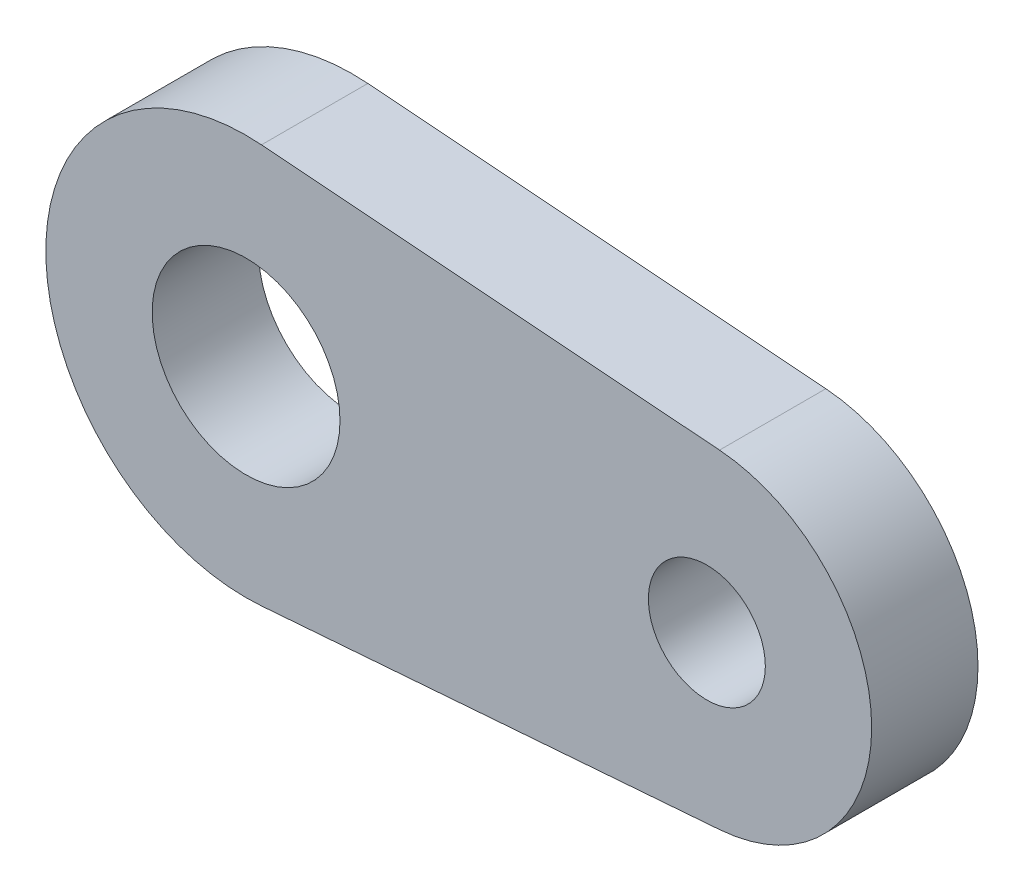
ISO-10303-21;
HEADER;
FILE_DESCRIPTION(('STEP AP214'),'2;1');
FILE_NAME('part.step','',(''),(''),'','','');
FILE_SCHEMA(('AUTOMOTIVE_DESIGN { 1 0 10303 214 1 1 1 1 }'));
ENDSEC;
DATA;
#1=APPLICATION_CONTEXT('core data for automotive mechanical design processes');
#2=APPLICATION_PROTOCOL_DEFINITION('international standard','automotive_design',2000,#1);
#3=PRODUCT_CONTEXT('',#1,'mechanical');
#4=PRODUCT('Part','Part','',(#3));
#5=PRODUCT_RELATED_PRODUCT_CATEGORY('part','',(#4));
#6=PRODUCT_DEFINITION_FORMATION('','',#4);
#7=PRODUCT_DEFINITION_CONTEXT('part definition',#1,'design');
#8=PRODUCT_DEFINITION('design','',#6,#7);
#9=PRODUCT_DEFINITION_SHAPE('','',#8);
#10=(LENGTH_UNIT() NAMED_UNIT(*) SI_UNIT(.MILLI.,.METRE.));
#11=(NAMED_UNIT(*) PLANE_ANGLE_UNIT() SI_UNIT($,.RADIAN.));
#12=(NAMED_UNIT(*) SI_UNIT($,.STERADIAN.) SOLID_ANGLE_UNIT());
#13=UNCERTAINTY_MEASURE_WITH_UNIT(LENGTH_MEASURE(1.E-05),#10,'distance_accuracy_value','');
#14=(GEOMETRIC_REPRESENTATION_CONTEXT(3) GLOBAL_UNCERTAINTY_ASSIGNED_CONTEXT((#13)) GLOBAL_UNIT_ASSIGNED_CONTEXT((#10,
#11,#12)) REPRESENTATION_CONTEXT('',''));
#15=CARTESIAN_POINT('',(0.,0.,0.));
#16=DIRECTION('',(0.,0.,1.));
#17=DIRECTION('',(1.,0.,0.));
#18=AXIS2_PLACEMENT_3D('',#15,#16,#17);
#19=CARTESIAN_POINT('',(0.,0.,1.5));
#20=DIRECTION('',(0.,0.,-1.));
#21=DIRECTION('',(-1.,0.,0.));
#22=AXIS2_PLACEMENT_3D('',#19,#20,#21);
#23=PLANE('',#22);
#24=CARTESIAN_POINT('',(0.,0.,1.5));
#25=DIRECTION('',(0.,0.,1.));
#26=DIRECTION('',(-1.,0.,0.));
#27=AXIS2_PLACEMENT_3D('',#24,#25,#26);
#28=CIRCLE('',#27,5.65);
#29=CARTESIAN_POINT('',(0.434615384615384,5.63325922246222,1.5));
#30=VERTEX_POINT('',#29);
#31=CARTESIAN_POINT('',(0.434615384615384,-5.63325922246222,1.5));
#32=VERTEX_POINT('',#31);
#33=EDGE_CURVE('E92',#30,#32,#28,.T.);
#34=ORIENTED_EDGE('',*,*,#33,.T.);
#35=DIRECTION('',(0.997037030524286,0.0769230769230769,0.));
#36=VECTOR('',#35,1.);
#37=CARTESIAN_POINT('',(13.3576923076923,-4.63622219193793,1.5));
#38=LINE('',#37,#36);
#39=CARTESIAN_POINT('',(13.3576923076923,-4.63622219193793,1.5));
#40=VERTEX_POINT('',#39);
#41=EDGE_CURVE('E87',#32,#40,#38,.T.);
#42=ORIENTED_EDGE('',*,*,#41,.T.);
#43=CARTESIAN_POINT('',(13.,0.,1.5));
#44=DIRECTION('',(0.,0.,1.));
#45=DIRECTION('',(-1.,0.,0.));
#46=AXIS2_PLACEMENT_3D('',#43,#44,#45);
#47=CIRCLE('',#46,4.65);
#48=CARTESIAN_POINT('',(13.3576923076923,4.63622219193793,1.5));
#49=VERTEX_POINT('',#48);
#50=EDGE_CURVE('E90',#40,#49,#47,.T.);
#51=ORIENTED_EDGE('',*,*,#50,.T.);
#52=DIRECTION('',(-0.997037030524286,0.0769230769230769,0.));
#53=VECTOR('',#52,1.);
#54=CARTESIAN_POINT('',(0.434615384615384,5.63325922246222,1.5));
#55=LINE('',#54,#53);
#56=EDGE_CURVE('E57',#49,#30,#55,.T.);
#57=ORIENTED_EDGE('',*,*,#56,.T.);
#58=EDGE_LOOP('',(#34,#42,#51,#57));
#59=FACE_BOUND('',#58,.T.);
#60=CARTESIAN_POINT('',(0.,0.,1.5));
#61=DIRECTION('',(0.,0.,1.));
#62=DIRECTION('',(1.,0.,0.));
#63=AXIS2_PLACEMENT_3D('',#60,#61,#62);
#64=CIRCLE('',#63,2.65);
#65=CARTESIAN_POINT('',(2.65,0.,1.5));
#66=VERTEX_POINT('',#65);
#67=EDGE_CURVE('E112',#66,#66,#64,.T.);
#68=ORIENTED_EDGE('',*,*,#67,.F.);
#69=EDGE_LOOP('',(#68));
#70=FACE_BOUND('',#69,.T.);
#71=CARTESIAN_POINT('',(13.,0.,1.5));
#72=DIRECTION('',(0.,0.,1.));
#73=DIRECTION('',(1.,0.,0.));
#74=AXIS2_PLACEMENT_3D('',#71,#72,#73);
#75=CIRCLE('',#74,1.65);
#76=CARTESIAN_POINT('',(14.65,0.,1.5));
#77=VERTEX_POINT('',#76);
#78=EDGE_CURVE('E134',#77,#77,#75,.T.);
#79=ORIENTED_EDGE('',*,*,#78,.F.);
#80=EDGE_LOOP('',(#79));
#81=FACE_BOUND('',#80,.T.);
#82=ADVANCED_FACE('F39',(#59,#70,#81),#23,.F.);
#83=CARTESIAN_POINT('',(0.,0.,-1.5));
#84=DIRECTION('',(0.,0.,-1.));
#85=DIRECTION('',(-1.,0.,0.));
#86=AXIS2_PLACEMENT_3D('',#83,#84,#85);
#87=PLANE('',#86);
#88=CARTESIAN_POINT('',(0.,0.,-1.5));
#89=DIRECTION('',(0.,0.,1.));
#90=DIRECTION('',(1.,0.,0.));
#91=AXIS2_PLACEMENT_3D('',#88,#89,#90);
#92=CIRCLE('',#91,2.65);
#93=CARTESIAN_POINT('',(2.65,0.,-1.5));
#94=VERTEX_POINT('',#93);
#95=EDGE_CURVE('E130',#94,#94,#92,.T.);
#96=ORIENTED_EDGE('',*,*,#95,.T.);
#97=EDGE_LOOP('',(#96));
#98=FACE_BOUND('',#97,.T.);
#99=CARTESIAN_POINT('',(0.,0.,-1.5));
#100=DIRECTION('',(0.,0.,1.));
#101=DIRECTION('',(-1.,0.,0.));
#102=AXIS2_PLACEMENT_3D('',#99,#100,#101);
#103=CIRCLE('',#102,5.65);
#104=CARTESIAN_POINT('',(0.434615384615384,5.63325922246222,-1.5));
#105=VERTEX_POINT('',#104);
#106=CARTESIAN_POINT('',(0.434615384615384,-5.63325922246222,-1.5));
#107=VERTEX_POINT('',#106);
#108=EDGE_CURVE('E108',#105,#107,#103,.T.);
#109=ORIENTED_EDGE('',*,*,#108,.F.);
#110=DIRECTION('',(-0.997037030524286,0.0769230769230769,0.));
#111=VECTOR('',#110,1.);
#112=CARTESIAN_POINT('',(0.434615384615384,5.63325922246222,-1.5));
#113=LINE('',#112,#111);
#114=CARTESIAN_POINT('',(13.3576923076923,4.63622219193793,-1.5));
#115=VERTEX_POINT('',#114);
#116=EDGE_CURVE('E80',#115,#105,#113,.T.);
#117=ORIENTED_EDGE('',*,*,#116,.F.);
#118=CARTESIAN_POINT('',(13.,0.,-1.5));
#119=DIRECTION('',(0.,0.,1.));
#120=DIRECTION('',(-1.,0.,0.));
#121=AXIS2_PLACEMENT_3D('',#118,#119,#120);
#122=CIRCLE('',#121,4.65);
#123=CARTESIAN_POINT('',(13.3576923076923,-4.63622219193793,-1.5));
#124=VERTEX_POINT('',#123);
#125=EDGE_CURVE('E74',#124,#115,#122,.T.);
#126=ORIENTED_EDGE('',*,*,#125,.F.);
#127=DIRECTION('',(0.997037030524286,0.0769230769230769,0.));
#128=VECTOR('',#127,1.);
#129=CARTESIAN_POINT('',(13.3576923076923,-4.63622219193793,-1.5));
#130=LINE('',#129,#128);
#131=EDGE_CURVE('E97',#107,#124,#130,.T.);
#132=ORIENTED_EDGE('',*,*,#131,.F.);
#133=EDGE_LOOP('',(#109,#117,#126,#132));
#134=FACE_BOUND('',#133,.T.);
#135=CARTESIAN_POINT('',(13.,0.,-1.5));
#136=DIRECTION('',(0.,0.,1.));
#137=DIRECTION('',(1.,0.,0.));
#138=AXIS2_PLACEMENT_3D('',#135,#136,#137);
#139=CIRCLE('',#138,1.65);
#140=CARTESIAN_POINT('',(14.65,0.,-1.5));
#141=VERTEX_POINT('',#140);
#142=EDGE_CURVE('E138',#141,#141,#139,.T.);
#143=ORIENTED_EDGE('',*,*,#142,.T.);
#144=EDGE_LOOP('',(#143));
#145=FACE_BOUND('',#144,.T.);
#146=ADVANCED_FACE('F125',(#98,#134,#145),#87,.T.);
#147=CARTESIAN_POINT('',(0.,0.,1.5));
#148=DIRECTION('',(0.,0.,-1.));
#149=DIRECTION('',(-1.,0.,0.));
#150=AXIS2_PLACEMENT_3D('',#147,#148,#149);
#151=CYLINDRICAL_SURFACE('',#150,5.65);
#152=ORIENTED_EDGE('',*,*,#108,.T.);
#153=DIRECTION('',(0.,0.,-1.));
#154=VECTOR('',#153,1.);
#155=CARTESIAN_POINT('',(0.434615384615384,-5.63325922246222,1.5));
#156=LINE('',#155,#154);
#157=EDGE_CURVE('E11',#32,#107,#156,.T.);
#158=ORIENTED_EDGE('',*,*,#157,.F.);
#159=ORIENTED_EDGE('',*,*,#33,.F.);
#160=DIRECTION('',(0.,0.,-1.));
#161=VECTOR('',#160,1.);
#162=CARTESIAN_POINT('',(0.434615384615384,5.63325922246222,1.5));
#163=LINE('',#162,#161);
#164=EDGE_CURVE('E104',#30,#105,#163,.T.);
#165=ORIENTED_EDGE('',*,*,#164,.T.);
#166=EDGE_LOOP('',(#152,#158,#159,#165));
#167=FACE_BOUND('',#166,.T.);
#168=ADVANCED_FACE('F41',(#167),#151,.T.);
#169=CARTESIAN_POINT('',(13.3576923076923,-4.63622219193793,1.5));
#170=DIRECTION('',(-0.0769230769230769,0.997037030524286,0.));
#171=DIRECTION('',(-0.997037030524286,-0.0769230769230769,0.));
#172=AXIS2_PLACEMENT_3D('',#169,#170,#171);
#173=PLANE('',#172);
#174=ORIENTED_EDGE('',*,*,#131,.T.);
#175=DIRECTION('',(0.,0.,-1.));
#176=VECTOR('',#175,1.);
#177=CARTESIAN_POINT('',(13.3576923076923,-4.63622219193793,1.5));
#178=LINE('',#177,#176);
#179=EDGE_CURVE('E49',#40,#124,#178,.T.);
#180=ORIENTED_EDGE('',*,*,#179,.F.);
#181=ORIENTED_EDGE('',*,*,#41,.F.);
#182=ORIENTED_EDGE('',*,*,#157,.T.);
#183=EDGE_LOOP('',(#174,#180,#181,#182));
#184=FACE_BOUND('',#183,.T.);
#185=ADVANCED_FACE('F96',(#184),#173,.F.);
#186=CARTESIAN_POINT('',(13.,0.,1.5));
#187=DIRECTION('',(0.,0.,-1.));
#188=DIRECTION('',(-1.,0.,0.));
#189=AXIS2_PLACEMENT_3D('',#186,#187,#188);
#190=CYLINDRICAL_SURFACE('',#189,4.65);
#191=ORIENTED_EDGE('',*,*,#125,.T.);
#192=DIRECTION('',(0.,0.,-1.));
#193=VECTOR('',#192,1.);
#194=CARTESIAN_POINT('',(13.3576923076923,4.63622219193793,1.5));
#195=LINE('',#194,#193);
#196=EDGE_CURVE('E99',#49,#115,#195,.T.);
#197=ORIENTED_EDGE('',*,*,#196,.F.);
#198=ORIENTED_EDGE('',*,*,#50,.F.);
#199=ORIENTED_EDGE('',*,*,#179,.T.);
#200=EDGE_LOOP('',(#191,#197,#198,#199));
#201=FACE_BOUND('',#200,.T.);
#202=ADVANCED_FACE('F100',(#201),#190,.T.);
#203=CARTESIAN_POINT('',(0.434615384615384,5.63325922246222,1.5));
#204=DIRECTION('',(-0.0769230769230769,-0.997037030524286,0.));
#205=DIRECTION('',(0.997037030524286,-0.0769230769230769,0.));
#206=AXIS2_PLACEMENT_3D('',#203,#204,#205);
#207=PLANE('',#206);
#208=ORIENTED_EDGE('',*,*,#116,.T.);
#209=ORIENTED_EDGE('',*,*,#164,.F.);
#210=ORIENTED_EDGE('',*,*,#56,.F.);
#211=ORIENTED_EDGE('',*,*,#196,.T.);
#212=EDGE_LOOP('',(#208,#209,#210,#211));
#213=FACE_BOUND('',#212,.T.);
#214=ADVANCED_FACE('F122',(#213),#207,.F.);
#215=CARTESIAN_POINT('',(0.,0.,1.5));
#216=DIRECTION('',(0.,0.,-1.));
#217=DIRECTION('',(-1.,0.,0.));
#218=AXIS2_PLACEMENT_3D('',#215,#216,#217);
#219=CYLINDRICAL_SURFACE('',#218,2.65);
#220=ORIENTED_EDGE('',*,*,#67,.T.);
#221=EDGE_LOOP('',(#220));
#222=FACE_BOUND('',#221,.T.);
#223=ORIENTED_EDGE('',*,*,#95,.F.);
#224=EDGE_LOOP('',(#223));
#225=FACE_BOUND('',#224,.T.);
#226=ADVANCED_FACE('F157',(#222,#225),#219,.F.);
#227=CARTESIAN_POINT('',(13.,0.,1.5));
#228=DIRECTION('',(0.,0.,-1.));
#229=DIRECTION('',(-1.,0.,0.));
#230=AXIS2_PLACEMENT_3D('',#227,#228,#229);
#231=CYLINDRICAL_SURFACE('',#230,1.65);
#232=ORIENTED_EDGE('',*,*,#78,.T.);
#233=EDGE_LOOP('',(#232));
#234=FACE_BOUND('',#233,.T.);
#235=ORIENTED_EDGE('',*,*,#142,.F.);
#236=EDGE_LOOP('',(#235));
#237=FACE_BOUND('',#236,.T.);
#238=ADVANCED_FACE('F146',(#234,#237),#231,.F.);
#239=CLOSED_SHELL('',(#82,#146,#168,#185,#202,#214,#226,#238));
#240=MANIFOLD_SOLID_BREP('B2',#239);
#241=ADVANCED_BREP_SHAPE_REPRESENTATION('',(#18,#240),#14);
#242=SHAPE_DEFINITION_REPRESENTATION(#9,#241);
ENDSEC;
END-ISO-10303-21;
